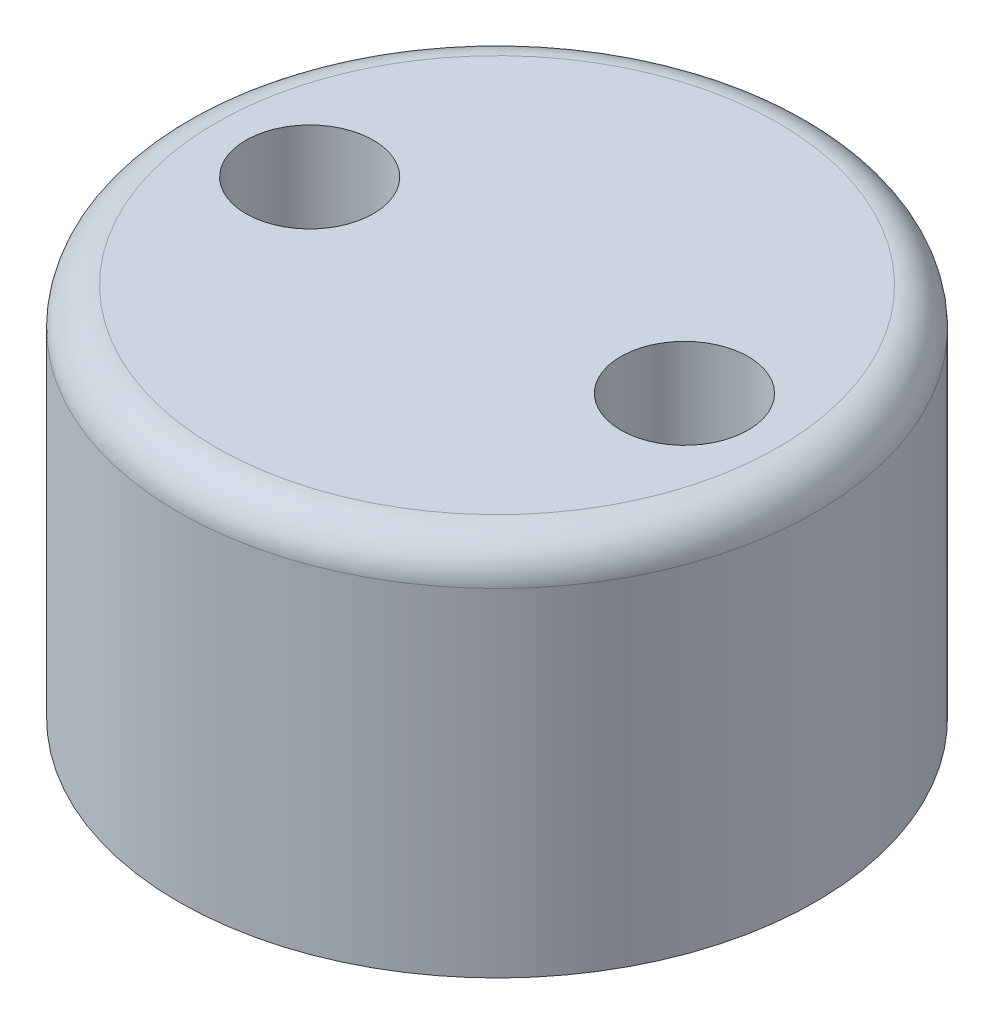
ISO-10303-21;
HEADER;
FILE_DESCRIPTION(('STEP AP214'),'2;1');
FILE_NAME('part.step','',(''),(''),'','','');
FILE_SCHEMA(('AUTOMOTIVE_DESIGN { 1 0 10303 214 1 1 1 1 }'));
ENDSEC;
DATA;
#1=APPLICATION_CONTEXT('core data for automotive mechanical design processes');
#2=APPLICATION_PROTOCOL_DEFINITION('international standard','automotive_design',2000,#1);
#3=PRODUCT_CONTEXT('',#1,'mechanical');
#4=PRODUCT('Part','Part','',(#3));
#5=PRODUCT_RELATED_PRODUCT_CATEGORY('part','',(#4));
#6=PRODUCT_DEFINITION_FORMATION('','',#4);
#7=PRODUCT_DEFINITION_CONTEXT('part definition',#1,'design');
#8=PRODUCT_DEFINITION('design','',#6,#7);
#9=PRODUCT_DEFINITION_SHAPE('','',#8);
#10=(LENGTH_UNIT() NAMED_UNIT(*) SI_UNIT(.MILLI.,.METRE.));
#11=(NAMED_UNIT(*) PLANE_ANGLE_UNIT() SI_UNIT($,.RADIAN.));
#12=(NAMED_UNIT(*) SI_UNIT($,.STERADIAN.) SOLID_ANGLE_UNIT());
#13=UNCERTAINTY_MEASURE_WITH_UNIT(LENGTH_MEASURE(1.E-05),#10,'distance_accuracy_value','');
#14=(GEOMETRIC_REPRESENTATION_CONTEXT(3) GLOBAL_UNCERTAINTY_ASSIGNED_CONTEXT((#13)) GLOBAL_UNIT_ASSIGNED_CONTEXT((#10,
#11,#12)) REPRESENTATION_CONTEXT('',''));
#15=CARTESIAN_POINT('',(0.,0.,0.));
#16=DIRECTION('',(0.,0.,1.));
#17=DIRECTION('',(1.,0.,0.));
#18=AXIS2_PLACEMENT_3D('',#15,#16,#17);
#19=CARTESIAN_POINT('',(0.,9.,0.));
#20=DIRECTION('',(0.,1.,0.));
#21=DIRECTION('',(0.,0.,1.));
#22=AXIS2_PLACEMENT_3D('',#19,#20,#21);
#23=TOROIDAL_SURFACE('',#22,7.5,1.);
#24=CARTESIAN_POINT('',(0.,10.,0.));
#25=DIRECTION('',(0.,1.,0.));
#26=DIRECTION('',(0.,0.,1.));
#27=AXIS2_PLACEMENT_3D('',#24,#25,#26);
#28=CIRCLE('',#27,7.5);
#29=CARTESIAN_POINT('',(0.,10.,7.5));
#30=VERTEX_POINT('',#29);
#31=EDGE_CURVE('E37',#30,#30,#28,.T.);
#32=ORIENTED_EDGE('',*,*,#31,.F.);
#33=EDGE_LOOP('',(#32));
#34=FACE_BOUND('',#33,.T.);
#35=CARTESIAN_POINT('',(0.,9.,0.));
#36=DIRECTION('',(0.,1.,0.));
#37=DIRECTION('',(0.,0.,1.));
#38=AXIS2_PLACEMENT_3D('',#35,#36,#37);
#39=CIRCLE('',#38,8.5);
#40=CARTESIAN_POINT('',(0.,9.,8.5));
#41=VERTEX_POINT('',#40);
#42=EDGE_CURVE('E10',#41,#41,#39,.F.);
#43=ORIENTED_EDGE('',*,*,#42,.F.);
#44=EDGE_LOOP('',(#43));
#45=FACE_BOUND('',#44,.T.);
#46=ADVANCED_FACE('F31',(#34,#45),#23,.T.);
#47=CARTESIAN_POINT('',(0.,10.,0.));
#48=DIRECTION('',(0.,-1.,0.));
#49=DIRECTION('',(0.,0.,-1.));
#50=AXIS2_PLACEMENT_3D('',#47,#48,#49);
#51=CYLINDRICAL_SURFACE('',#50,8.5);
#52=ORIENTED_EDGE('',*,*,#42,.T.);
#53=EDGE_LOOP('',(#52));
#54=FACE_BOUND('',#53,.T.);
#55=CARTESIAN_POINT('',(0.,0.,0.));
#56=DIRECTION('',(0.,1.,0.));
#57=DIRECTION('',(0.,0.,1.));
#58=AXIS2_PLACEMENT_3D('',#55,#56,#57);
#59=CIRCLE('',#58,8.5);
#60=CARTESIAN_POINT('',(0.,0.,8.5));
#61=VERTEX_POINT('',#60);
#62=EDGE_CURVE('E41',#61,#61,#59,.T.);
#63=ORIENTED_EDGE('',*,*,#62,.T.);
#64=EDGE_LOOP('',(#63));
#65=FACE_BOUND('',#64,.T.);
#66=ADVANCED_FACE('F66',(#54,#65),#51,.T.);
#67=CARTESIAN_POINT('',(0.,10.,0.));
#68=DIRECTION('',(0.,1.,0.));
#69=DIRECTION('',(0.,0.,1.));
#70=AXIS2_PLACEMENT_3D('',#67,#68,#69);
#71=PLANE('',#70);
#72=CARTESIAN_POINT('',(-5.,10.,0.));
#73=DIRECTION('',(0.,1.,0.));
#74=DIRECTION('',(0.,0.,1.));
#75=AXIS2_PLACEMENT_3D('',#72,#73,#74);
#76=CIRCLE('',#75,1.69999999999999);
#77=CARTESIAN_POINT('',(-5.,10.,1.69999999999999));
#78=VERTEX_POINT('',#77);
#79=EDGE_CURVE('E56',#78,#78,#76,.T.);
#80=ORIENTED_EDGE('',*,*,#79,.F.);
#81=EDGE_LOOP('',(#80));
#82=FACE_BOUND('',#81,.T.);
#83=CARTESIAN_POINT('',(5.,10.,0.));
#84=DIRECTION('',(0.,1.,0.));
#85=DIRECTION('',(0.,0.,1.));
#86=AXIS2_PLACEMENT_3D('',#83,#84,#85);
#87=CIRCLE('',#86,1.69999999999999);
#88=CARTESIAN_POINT('',(5.,10.,1.69999999999999));
#89=VERTEX_POINT('',#88);
#90=EDGE_CURVE('E50',#89,#89,#87,.T.);
#91=ORIENTED_EDGE('',*,*,#90,.F.);
#92=EDGE_LOOP('',(#91));
#93=FACE_BOUND('',#92,.T.);
#94=ORIENTED_EDGE('',*,*,#31,.T.);
#95=EDGE_LOOP('',(#94));
#96=FACE_BOUND('',#95,.T.);
#97=ADVANCED_FACE('F62',(#82,#93,#96),#71,.T.);
#98=CARTESIAN_POINT('',(0.,0.,0.));
#99=DIRECTION('',(0.,1.,0.));
#100=DIRECTION('',(0.,0.,1.));
#101=AXIS2_PLACEMENT_3D('',#98,#99,#100);
#102=PLANE('',#101);
#103=CARTESIAN_POINT('',(-5.,0.,0.));
#104=DIRECTION('',(0.,1.,0.));
#105=DIRECTION('',(0.,0.,1.));
#106=AXIS2_PLACEMENT_3D('',#103,#104,#105);
#107=CIRCLE('',#106,1.7);
#108=CARTESIAN_POINT('',(-5.,0.,1.7));
#109=VERTEX_POINT('',#108);
#110=EDGE_CURVE('E53',#109,#109,#107,.T.);
#111=ORIENTED_EDGE('',*,*,#110,.T.);
#112=EDGE_LOOP('',(#111));
#113=FACE_BOUND('',#112,.T.);
#114=CARTESIAN_POINT('',(5.,0.,0.));
#115=DIRECTION('',(0.,1.,0.));
#116=DIRECTION('',(0.,0.,1.));
#117=AXIS2_PLACEMENT_3D('',#114,#115,#116);
#118=CIRCLE('',#117,1.7);
#119=CARTESIAN_POINT('',(5.,0.,1.7));
#120=VERTEX_POINT('',#119);
#121=EDGE_CURVE('E45',#120,#120,#118,.T.);
#122=ORIENTED_EDGE('',*,*,#121,.T.);
#123=EDGE_LOOP('',(#122));
#124=FACE_BOUND('',#123,.T.);
#125=ORIENTED_EDGE('',*,*,#62,.F.);
#126=EDGE_LOOP('',(#125));
#127=FACE_BOUND('',#126,.T.);
#128=ADVANCED_FACE('F65',(#113,#124,#127),#102,.F.);
#129=CARTESIAN_POINT('',(5.,10.,0.));
#130=DIRECTION('',(0.,1.,0.));
#131=DIRECTION('',(0.,0.,1.));
#132=AXIS2_PLACEMENT_3D('',#129,#130,#131);
#133=CYLINDRICAL_SURFACE('',#132,1.69999999999999);
#134=ORIENTED_EDGE('',*,*,#121,.F.);
#135=EDGE_LOOP('',(#134));
#136=FACE_BOUND('',#135,.T.);
#137=ORIENTED_EDGE('',*,*,#90,.T.);
#138=EDGE_LOOP('',(#137));
#139=FACE_BOUND('',#138,.T.);
#140=ADVANCED_FACE('F70',(#136,#139),#133,.F.);
#141=CARTESIAN_POINT('',(-5.,10.,0.));
#142=DIRECTION('',(0.,1.,0.));
#143=DIRECTION('',(0.,0.,1.));
#144=AXIS2_PLACEMENT_3D('',#141,#142,#143);
#145=CYLINDRICAL_SURFACE('',#144,1.69999999999999);
#146=ORIENTED_EDGE('',*,*,#110,.F.);
#147=EDGE_LOOP('',(#146));
#148=FACE_BOUND('',#147,.T.);
#149=ORIENTED_EDGE('',*,*,#79,.T.);
#150=EDGE_LOOP('',(#149));
#151=FACE_BOUND('',#150,.T.);
#152=ADVANCED_FACE('F60',(#148,#151),#145,.F.);
#153=CLOSED_SHELL('',(#46,#66,#97,#128,#140,#152));
#154=MANIFOLD_SOLID_BREP('B2',#153);
#155=ADVANCED_BREP_SHAPE_REPRESENTATION('',(#18,#154),#14);
#156=SHAPE_DEFINITION_REPRESENTATION(#9,#155);
ENDSEC;
END-ISO-10303-21;
